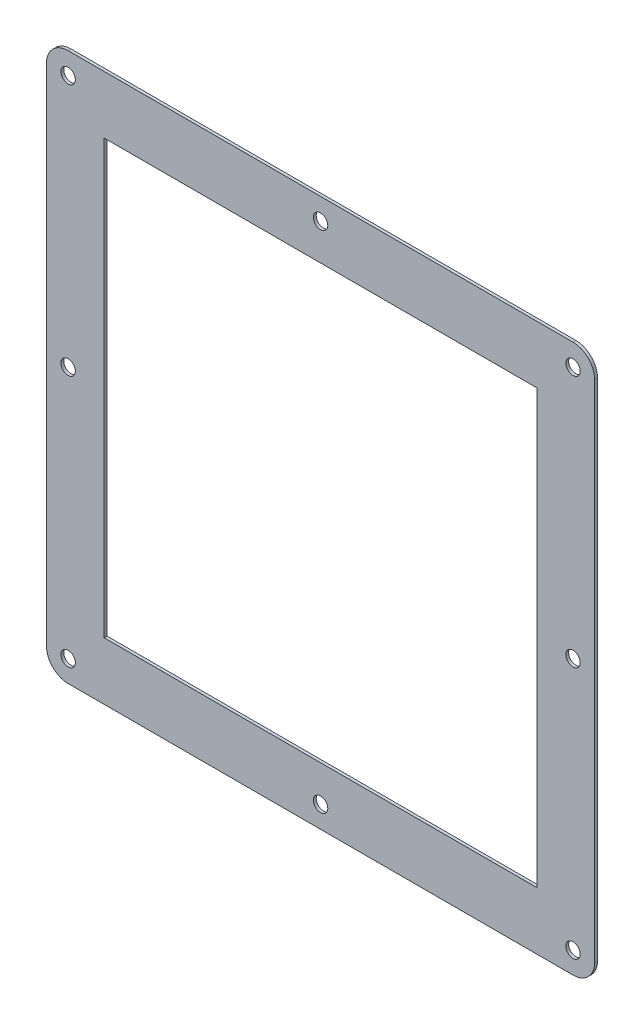
ISO-10303-21;
HEADER;
FILE_DESCRIPTION(('STEP AP214'),'2;1');
FILE_NAME('part.step','',(''),(''),'','','');
FILE_SCHEMA(('AUTOMOTIVE_DESIGN { 1 0 10303 214 1 1 1 1 }'));
ENDSEC;
DATA;
#1=APPLICATION_CONTEXT('core data for automotive mechanical design processes');
#2=APPLICATION_PROTOCOL_DEFINITION('international standard','automotive_design',2000,#1);
#3=PRODUCT_CONTEXT('',#1,'mechanical');
#4=PRODUCT('Part','Part','',(#3));
#5=PRODUCT_RELATED_PRODUCT_CATEGORY('part','',(#4));
#6=PRODUCT_DEFINITION_FORMATION('','',#4);
#7=PRODUCT_DEFINITION_CONTEXT('part definition',#1,'design');
#8=PRODUCT_DEFINITION('design','',#6,#7);
#9=PRODUCT_DEFINITION_SHAPE('','',#8);
#10=(LENGTH_UNIT() NAMED_UNIT(*) SI_UNIT(.MILLI.,.METRE.));
#11=(NAMED_UNIT(*) PLANE_ANGLE_UNIT() SI_UNIT($,.RADIAN.));
#12=(NAMED_UNIT(*) SI_UNIT($,.STERADIAN.) SOLID_ANGLE_UNIT());
#13=UNCERTAINTY_MEASURE_WITH_UNIT(LENGTH_MEASURE(1.E-05),#10,'distance_accuracy_value','');
#14=(GEOMETRIC_REPRESENTATION_CONTEXT(3) GLOBAL_UNCERTAINTY_ASSIGNED_CONTEXT((#13)) GLOBAL_UNIT_ASSIGNED_CONTEXT((#10,
#11,#12)) REPRESENTATION_CONTEXT('',''));
#15=CARTESIAN_POINT('',(0.,0.,0.));
#16=DIRECTION('',(0.,0.,1.));
#17=DIRECTION('',(1.,0.,0.));
#18=AXIS2_PLACEMENT_3D('',#15,#16,#17);
#19=CARTESIAN_POINT('',(-175.,-175.,2.));
#20=DIRECTION('',(0.,0.,1.));
#21=DIRECTION('',(1.,0.,0.));
#22=AXIS2_PLACEMENT_3D('',#19,#20,#21);
#23=PLANE('',#22);
#24=CARTESIAN_POINT('',(0.,-175.,2.));
#25=DIRECTION('',(0.,0.,1.));
#26=DIRECTION('',(1.,0.,0.));
#27=AXIS2_PLACEMENT_3D('',#24,#25,#26);
#28=CIRCLE('',#27,5.);
#29=CARTESIAN_POINT('',(5.,-175.,2.));
#30=VERTEX_POINT('',#29);
#31=EDGE_CURVE('E372',#30,#30,#28,.T.);
#32=ORIENTED_EDGE('',*,*,#31,.F.);
#33=EDGE_LOOP('',(#32));
#34=FACE_BOUND('',#33,.T.);
#35=DIRECTION('',(-1.,0.,0.));
#36=VECTOR('',#35,1.);
#37=CARTESIAN_POINT('',(-150.,150.,2.));
#38=LINE('',#37,#36);
#39=CARTESIAN_POINT('',(150.,150.,2.));
#40=VERTEX_POINT('',#39);
#41=CARTESIAN_POINT('',(-150.,150.,2.));
#42=VERTEX_POINT('',#41);
#43=EDGE_CURVE('E130',#40,#42,#38,.T.);
#44=ORIENTED_EDGE('',*,*,#43,.F.);
#45=DIRECTION('',(0.,1.,0.));
#46=VECTOR('',#45,1.);
#47=CARTESIAN_POINT('',(150.,150.,2.));
#48=LINE('',#47,#46);
#49=CARTESIAN_POINT('',(150.,-150.,2.));
#50=VERTEX_POINT('',#49);
#51=EDGE_CURVE('E122',#50,#40,#48,.T.);
#52=ORIENTED_EDGE('',*,*,#51,.F.);
#53=DIRECTION('',(1.,0.,0.));
#54=VECTOR('',#53,1.);
#55=CARTESIAN_POINT('',(-150.,-150.,2.));
#56=LINE('',#55,#54);
#57=CARTESIAN_POINT('',(-150.,-150.,2.));
#58=VERTEX_POINT('',#57);
#59=EDGE_CURVE('E145',#58,#50,#56,.T.);
#60=ORIENTED_EDGE('',*,*,#59,.F.);
#61=DIRECTION('',(0.,-1.,0.));
#62=VECTOR('',#61,1.);
#63=CARTESIAN_POINT('',(-150.,150.,2.));
#64=LINE('',#63,#62);
#65=EDGE_CURVE('E143',#42,#58,#64,.T.);
#66=ORIENTED_EDGE('',*,*,#65,.F.);
#67=EDGE_LOOP('',(#44,#52,#60,#66));
#68=FACE_BOUND('',#67,.T.);
#69=CARTESIAN_POINT('',(-175.,0.,2.));
#70=DIRECTION('',(0.,0.,1.));
#71=DIRECTION('',(1.,0.,0.));
#72=AXIS2_PLACEMENT_3D('',#69,#70,#71);
#73=CIRCLE('',#72,5.00000000000002);
#74=CARTESIAN_POINT('',(-170.,0.,2.));
#75=VERTEX_POINT('',#74);
#76=EDGE_CURVE('E161',#75,#75,#73,.T.);
#77=ORIENTED_EDGE('',*,*,#76,.F.);
#78=EDGE_LOOP('',(#77));
#79=FACE_BOUND('',#78,.T.);
#80=CARTESIAN_POINT('',(175.,175.,2.));
#81=DIRECTION('',(0.,0.,1.));
#82=DIRECTION('',(1.,0.,0.));
#83=AXIS2_PLACEMENT_3D('',#80,#81,#82);
#84=CIRCLE('',#83,4.99999999999999);
#85=CARTESIAN_POINT('',(180.,175.,2.));
#86=VERTEX_POINT('',#85);
#87=EDGE_CURVE('E173',#86,#86,#84,.T.);
#88=ORIENTED_EDGE('',*,*,#87,.F.);
#89=EDGE_LOOP('',(#88));
#90=FACE_BOUND('',#89,.T.);
#91=CARTESIAN_POINT('',(-175.,175.,2.));
#92=DIRECTION('',(0.,0.,1.));
#93=DIRECTION('',(1.,0.,0.));
#94=AXIS2_PLACEMENT_3D('',#91,#92,#93);
#95=CIRCLE('',#94,4.99999999999999);
#96=CARTESIAN_POINT('',(-170.,175.,2.));
#97=VERTEX_POINT('',#96);
#98=EDGE_CURVE('E185',#97,#97,#95,.T.);
#99=ORIENTED_EDGE('',*,*,#98,.F.);
#100=EDGE_LOOP('',(#99));
#101=FACE_BOUND('',#100,.T.);
#102=CARTESIAN_POINT('',(-175.,-175.,2.));
#103=DIRECTION('',(0.,0.,1.));
#104=DIRECTION('',(1.,0.,0.));
#105=AXIS2_PLACEMENT_3D('',#102,#103,#104);
#106=CIRCLE('',#105,15.);
#107=CARTESIAN_POINT('',(-190.,-175.,2.));
#108=VERTEX_POINT('',#107);
#109=CARTESIAN_POINT('',(-175.,-190.,2.));
#110=VERTEX_POINT('',#109);
#111=EDGE_CURVE('E191',#108,#110,#106,.T.);
#112=ORIENTED_EDGE('',*,*,#111,.T.);
#113=DIRECTION('',(1.,0.,0.));
#114=VECTOR('',#113,1.);
#115=CARTESIAN_POINT('',(-175.,-190.,2.));
#116=LINE('',#115,#114);
#117=CARTESIAN_POINT('',(175.,-190.,2.));
#118=VERTEX_POINT('',#117);
#119=EDGE_CURVE('E194',#110,#118,#116,.T.);
#120=ORIENTED_EDGE('',*,*,#119,.T.);
#121=CARTESIAN_POINT('',(175.,-175.,2.));
#122=DIRECTION('',(0.,0.,1.));
#123=DIRECTION('',(1.,0.,0.));
#124=AXIS2_PLACEMENT_3D('',#121,#122,#123);
#125=CIRCLE('',#124,15.);
#126=CARTESIAN_POINT('',(190.,-175.,2.));
#127=VERTEX_POINT('',#126);
#128=EDGE_CURVE('E197',#118,#127,#125,.T.);
#129=ORIENTED_EDGE('',*,*,#128,.T.);
#130=DIRECTION('',(0.,1.,0.));
#131=VECTOR('',#130,1.);
#132=CARTESIAN_POINT('',(190.,175.,2.));
#133=LINE('',#132,#131);
#134=CARTESIAN_POINT('',(190.,175.,2.));
#135=VERTEX_POINT('',#134);
#136=EDGE_CURVE('E199',#127,#135,#133,.T.);
#137=ORIENTED_EDGE('',*,*,#136,.T.);
#138=CARTESIAN_POINT('',(175.,175.,2.));
#139=DIRECTION('',(0.,0.,1.));
#140=DIRECTION('',(-1.,0.,0.));
#141=AXIS2_PLACEMENT_3D('',#138,#139,#140);
#142=CIRCLE('',#141,15.);
#143=CARTESIAN_POINT('',(175.,190.,2.));
#144=VERTEX_POINT('',#143);
#145=EDGE_CURVE('E201',#135,#144,#142,.T.);
#146=ORIENTED_EDGE('',*,*,#145,.T.);
#147=DIRECTION('',(-1.,0.,0.));
#148=VECTOR('',#147,1.);
#149=CARTESIAN_POINT('',(-175.,190.,2.));
#150=LINE('',#149,#148);
#151=CARTESIAN_POINT('',(-175.,190.,2.));
#152=VERTEX_POINT('',#151);
#153=EDGE_CURVE('E203',#144,#152,#150,.T.);
#154=ORIENTED_EDGE('',*,*,#153,.T.);
#155=CARTESIAN_POINT('',(-175.,175.,2.));
#156=DIRECTION('',(0.,0.,1.));
#157=DIRECTION('',(1.,0.,0.));
#158=AXIS2_PLACEMENT_3D('',#155,#156,#157);
#159=CIRCLE('',#158,15.0000000000001);
#160=CARTESIAN_POINT('',(-190.,175.,2.));
#161=VERTEX_POINT('',#160);
#162=EDGE_CURVE('E205',#152,#161,#159,.T.);
#163=ORIENTED_EDGE('',*,*,#162,.T.);
#164=DIRECTION('',(0.,-1.,0.));
#165=VECTOR('',#164,1.);
#166=CARTESIAN_POINT('',(-190.,175.,2.));
#167=LINE('',#166,#165);
#168=EDGE_CURVE('E207',#161,#108,#167,.T.);
#169=ORIENTED_EDGE('',*,*,#168,.T.);
#170=EDGE_LOOP('',(#112,#120,#129,#137,#146,#154,#163,#169));
#171=FACE_BOUND('',#170,.T.);
#172=CARTESIAN_POINT('',(0.,175.,2.));
#173=DIRECTION('',(0.,0.,1.));
#174=DIRECTION('',(1.,0.,0.));
#175=AXIS2_PLACEMENT_3D('',#172,#173,#174);
#176=CIRCLE('',#175,5.00000000000001);
#177=CARTESIAN_POINT('',(5.00000000000001,175.,2.));
#178=VERTEX_POINT('',#177);
#179=EDGE_CURVE('E179',#178,#178,#176,.T.);
#180=ORIENTED_EDGE('',*,*,#179,.F.);
#181=EDGE_LOOP('',(#180));
#182=FACE_BOUND('',#181,.T.);
#183=CARTESIAN_POINT('',(175.,0.,2.));
#184=DIRECTION('',(0.,0.,1.));
#185=DIRECTION('',(1.,0.,0.));
#186=AXIS2_PLACEMENT_3D('',#183,#184,#185);
#187=CIRCLE('',#186,5.00000000000002);
#188=CARTESIAN_POINT('',(180.,0.,2.));
#189=VERTEX_POINT('',#188);
#190=EDGE_CURVE('E167',#189,#189,#187,.T.);
#191=ORIENTED_EDGE('',*,*,#190,.F.);
#192=EDGE_LOOP('',(#191));
#193=FACE_BOUND('',#192,.T.);
#194=CARTESIAN_POINT('',(-175.,-175.,2.));
#195=DIRECTION('',(0.,0.,1.));
#196=DIRECTION('',(1.,0.,0.));
#197=AXIS2_PLACEMENT_3D('',#194,#195,#196);
#198=CIRCLE('',#197,4.99999999999999);
#199=CARTESIAN_POINT('',(-170.,-175.,2.));
#200=VERTEX_POINT('',#199);
#201=EDGE_CURVE('E151',#200,#200,#198,.T.);
#202=ORIENTED_EDGE('',*,*,#201,.F.);
#203=EDGE_LOOP('',(#202));
#204=FACE_BOUND('',#203,.T.);
#205=CARTESIAN_POINT('',(175.,-175.,2.));
#206=DIRECTION('',(0.,0.,1.));
#207=DIRECTION('',(1.,0.,0.));
#208=AXIS2_PLACEMENT_3D('',#205,#206,#207);
#209=CIRCLE('',#208,4.99999999999999);
#210=CARTESIAN_POINT('',(180.,-175.,2.));
#211=VERTEX_POINT('',#210);
#212=EDGE_CURVE('E363',#211,#211,#209,.T.);
#213=ORIENTED_EDGE('',*,*,#212,.F.);
#214=EDGE_LOOP('',(#213));
#215=FACE_BOUND('',#214,.T.);
#216=ADVANCED_FACE('F33',(#34,#68,#79,#90,#101,#171,#182,#193,#204,#215),#23,.T.);
#217=CARTESIAN_POINT('',(-175.,-175.,0.));
#218=DIRECTION('',(0.,0.,1.));
#219=DIRECTION('',(1.,0.,0.));
#220=AXIS2_PLACEMENT_3D('',#217,#218,#219);
#221=PLANE('',#220);
#222=CARTESIAN_POINT('',(-175.,0.,0.));
#223=DIRECTION('',(0.,0.,1.));
#224=DIRECTION('',(1.,0.,0.));
#225=AXIS2_PLACEMENT_3D('',#222,#223,#224);
#226=CIRCLE('',#225,5.00000000000002);
#227=CARTESIAN_POINT('',(-170.,0.,0.));
#228=VERTEX_POINT('',#227);
#229=EDGE_CURVE('E138',#228,#228,#226,.T.);
#230=ORIENTED_EDGE('',*,*,#229,.T.);
#231=EDGE_LOOP('',(#230));
#232=FACE_BOUND('',#231,.T.);
#233=CARTESIAN_POINT('',(175.,0.,0.));
#234=DIRECTION('',(0.,0.,1.));
#235=DIRECTION('',(1.,0.,0.));
#236=AXIS2_PLACEMENT_3D('',#233,#234,#235);
#237=CIRCLE('',#236,5.00000000000002);
#238=CARTESIAN_POINT('',(180.,0.,0.));
#239=VERTEX_POINT('',#238);
#240=EDGE_CURVE('E164',#239,#239,#237,.T.);
#241=ORIENTED_EDGE('',*,*,#240,.T.);
#242=EDGE_LOOP('',(#241));
#243=FACE_BOUND('',#242,.T.);
#244=CARTESIAN_POINT('',(175.,175.,0.));
#245=DIRECTION('',(0.,0.,1.));
#246=DIRECTION('',(1.,0.,0.));
#247=AXIS2_PLACEMENT_3D('',#244,#245,#246);
#248=CIRCLE('',#247,4.99999999999999);
#249=CARTESIAN_POINT('',(180.,175.,0.));
#250=VERTEX_POINT('',#249);
#251=EDGE_CURVE('E170',#250,#250,#248,.T.);
#252=ORIENTED_EDGE('',*,*,#251,.T.);
#253=EDGE_LOOP('',(#252));
#254=FACE_BOUND('',#253,.T.);
#255=CARTESIAN_POINT('',(0.,175.,0.));
#256=DIRECTION('',(0.,0.,1.));
#257=DIRECTION('',(1.,0.,0.));
#258=AXIS2_PLACEMENT_3D('',#255,#256,#257);
#259=CIRCLE('',#258,5.00000000000001);
#260=CARTESIAN_POINT('',(5.00000000000001,175.,0.));
#261=VERTEX_POINT('',#260);
#262=EDGE_CURVE('E176',#261,#261,#259,.T.);
#263=ORIENTED_EDGE('',*,*,#262,.T.);
#264=EDGE_LOOP('',(#263));
#265=FACE_BOUND('',#264,.T.);
#266=CARTESIAN_POINT('',(-175.,175.,0.));
#267=DIRECTION('',(0.,0.,1.));
#268=DIRECTION('',(1.,0.,0.));
#269=AXIS2_PLACEMENT_3D('',#266,#267,#268);
#270=CIRCLE('',#269,4.99999999999999);
#271=CARTESIAN_POINT('',(-170.,175.,0.));
#272=VERTEX_POINT('',#271);
#273=EDGE_CURVE('E182',#272,#272,#270,.T.);
#274=ORIENTED_EDGE('',*,*,#273,.T.);
#275=EDGE_LOOP('',(#274));
#276=FACE_BOUND('',#275,.T.);
#277=CARTESIAN_POINT('',(-175.,-175.,0.));
#278=DIRECTION('',(0.,0.,1.));
#279=DIRECTION('',(1.,0.,0.));
#280=AXIS2_PLACEMENT_3D('',#277,#278,#279);
#281=CIRCLE('',#280,15.);
#282=CARTESIAN_POINT('',(-190.,-175.,0.));
#283=VERTEX_POINT('',#282);
#284=CARTESIAN_POINT('',(-175.,-190.,0.));
#285=VERTEX_POINT('',#284);
#286=EDGE_CURVE('E188',#283,#285,#281,.T.);
#287=ORIENTED_EDGE('',*,*,#286,.F.);
#288=DIRECTION('',(0.,-1.,0.));
#289=VECTOR('',#288,1.);
#290=CARTESIAN_POINT('',(-190.,175.,0.));
#291=LINE('',#290,#289);
#292=CARTESIAN_POINT('',(-190.,175.,0.));
#293=VERTEX_POINT('',#292);
#294=EDGE_CURVE('E195',#293,#283,#291,.T.);
#295=ORIENTED_EDGE('',*,*,#294,.F.);
#296=CARTESIAN_POINT('',(-175.,175.,0.));
#297=DIRECTION('',(0.,0.,1.));
#298=DIRECTION('',(1.,0.,0.));
#299=AXIS2_PLACEMENT_3D('',#296,#297,#298);
#300=CIRCLE('',#299,15.0000000000001);
#301=CARTESIAN_POINT('',(-175.,190.,0.));
#302=VERTEX_POINT('',#301);
#303=EDGE_CURVE('E222',#302,#293,#300,.T.);
#304=ORIENTED_EDGE('',*,*,#303,.F.);
#305=DIRECTION('',(-1.,0.,0.));
#306=VECTOR('',#305,1.);
#307=CARTESIAN_POINT('',(-175.,190.,0.));
#308=LINE('',#307,#306);
#309=CARTESIAN_POINT('',(175.,190.,0.));
#310=VERTEX_POINT('',#309);
#311=EDGE_CURVE('E220',#310,#302,#308,.T.);
#312=ORIENTED_EDGE('',*,*,#311,.F.);
#313=CARTESIAN_POINT('',(175.,175.,0.));
#314=DIRECTION('',(0.,0.,1.));
#315=DIRECTION('',(-1.,0.,0.));
#316=AXIS2_PLACEMENT_3D('',#313,#314,#315);
#317=CIRCLE('',#316,15.);
#318=CARTESIAN_POINT('',(190.,175.,0.));
#319=VERTEX_POINT('',#318);
#320=EDGE_CURVE('E218',#319,#310,#317,.T.);
#321=ORIENTED_EDGE('',*,*,#320,.F.);
#322=DIRECTION('',(0.,1.,0.));
#323=VECTOR('',#322,1.);
#324=CARTESIAN_POINT('',(190.,175.,0.));
#325=LINE('',#324,#323);
#326=CARTESIAN_POINT('',(190.,-175.,0.));
#327=VERTEX_POINT('',#326);
#328=EDGE_CURVE('E216',#327,#319,#325,.T.);
#329=ORIENTED_EDGE('',*,*,#328,.F.);
#330=CARTESIAN_POINT('',(175.,-175.,0.));
#331=DIRECTION('',(0.,0.,1.));
#332=DIRECTION('',(1.,0.,0.));
#333=AXIS2_PLACEMENT_3D('',#330,#331,#332);
#334=CIRCLE('',#333,15.);
#335=CARTESIAN_POINT('',(175.,-190.,0.));
#336=VERTEX_POINT('',#335);
#337=EDGE_CURVE('E214',#336,#327,#334,.T.);
#338=ORIENTED_EDGE('',*,*,#337,.F.);
#339=DIRECTION('',(1.,0.,0.));
#340=VECTOR('',#339,1.);
#341=CARTESIAN_POINT('',(-175.,-190.,0.));
#342=LINE('',#341,#340);
#343=EDGE_CURVE('E212',#285,#336,#342,.T.);
#344=ORIENTED_EDGE('',*,*,#343,.F.);
#345=EDGE_LOOP('',(#287,#295,#304,#312,#321,#329,#338,#344));
#346=FACE_BOUND('',#345,.T.);
#347=DIRECTION('',(0.,1.,0.));
#348=VECTOR('',#347,1.);
#349=CARTESIAN_POINT('',(150.,150.,0.));
#350=LINE('',#349,#348);
#351=CARTESIAN_POINT('',(150.,-150.,0.));
#352=VERTEX_POINT('',#351);
#353=CARTESIAN_POINT('',(150.,150.,0.));
#354=VERTEX_POINT('',#353);
#355=EDGE_CURVE('E56',#352,#354,#350,.T.);
#356=ORIENTED_EDGE('',*,*,#355,.T.);
#357=DIRECTION('',(-1.,0.,0.));
#358=VECTOR('',#357,1.);
#359=CARTESIAN_POINT('',(-150.,150.,0.));
#360=LINE('',#359,#358);
#361=CARTESIAN_POINT('',(-150.,150.,0.));
#362=VERTEX_POINT('',#361);
#363=EDGE_CURVE('E137',#354,#362,#360,.T.);
#364=ORIENTED_EDGE('',*,*,#363,.T.);
#365=DIRECTION('',(0.,-1.,0.));
#366=VECTOR('',#365,1.);
#367=CARTESIAN_POINT('',(-150.,150.,0.));
#368=LINE('',#367,#366);
#369=CARTESIAN_POINT('',(-150.,-150.,0.));
#370=VERTEX_POINT('',#369);
#371=EDGE_CURVE('E153',#362,#370,#368,.T.);
#372=ORIENTED_EDGE('',*,*,#371,.T.);
#373=DIRECTION('',(1.,0.,0.));
#374=VECTOR('',#373,1.);
#375=CARTESIAN_POINT('',(-150.,-150.,0.));
#376=LINE('',#375,#374);
#377=EDGE_CURVE('E131',#370,#352,#376,.T.);
#378=ORIENTED_EDGE('',*,*,#377,.T.);
#379=EDGE_LOOP('',(#356,#364,#372,#378));
#380=FACE_BOUND('',#379,.T.);
#381=CARTESIAN_POINT('',(-175.,-175.,0.));
#382=DIRECTION('',(0.,0.,1.));
#383=DIRECTION('',(1.,0.,0.));
#384=AXIS2_PLACEMENT_3D('',#381,#382,#383);
#385=CIRCLE('',#384,4.99999999999999);
#386=CARTESIAN_POINT('',(-170.,-175.,0.));
#387=VERTEX_POINT('',#386);
#388=EDGE_CURVE('E375',#387,#387,#385,.T.);
#389=ORIENTED_EDGE('',*,*,#388,.T.);
#390=EDGE_LOOP('',(#389));
#391=FACE_BOUND('',#390,.T.);
#392=CARTESIAN_POINT('',(0.,-175.,0.));
#393=DIRECTION('',(0.,0.,1.));
#394=DIRECTION('',(1.,0.,0.));
#395=AXIS2_PLACEMENT_3D('',#392,#393,#394);
#396=CIRCLE('',#395,5.);
#397=CARTESIAN_POINT('',(5.,-175.,0.));
#398=VERTEX_POINT('',#397);
#399=EDGE_CURVE('E369',#398,#398,#396,.T.);
#400=ORIENTED_EDGE('',*,*,#399,.T.);
#401=EDGE_LOOP('',(#400));
#402=FACE_BOUND('',#401,.T.);
#403=CARTESIAN_POINT('',(175.,-175.,0.));
#404=DIRECTION('',(0.,0.,1.));
#405=DIRECTION('',(1.,0.,0.));
#406=AXIS2_PLACEMENT_3D('',#403,#404,#405);
#407=CIRCLE('',#406,4.99999999999999);
#408=CARTESIAN_POINT('',(180.,-175.,0.));
#409=VERTEX_POINT('',#408);
#410=EDGE_CURVE('E366',#409,#409,#407,.T.);
#411=ORIENTED_EDGE('',*,*,#410,.T.);
#412=EDGE_LOOP('',(#411));
#413=FACE_BOUND('',#412,.T.);
#414=ADVANCED_FACE('F252',(#232,#243,#254,#265,#276,#346,#380,#391,#402,#413),#221,.F.);
#415=CARTESIAN_POINT('',(-175.,-175.,2.));
#416=DIRECTION('',(0.,0.,-1.));
#417=DIRECTION('',(-1.,0.,0.));
#418=AXIS2_PLACEMENT_3D('',#415,#416,#417);
#419=CYLINDRICAL_SURFACE('',#418,15.);
#420=ORIENTED_EDGE('',*,*,#286,.T.);
#421=DIRECTION('',(0.,0.,-1.));
#422=VECTOR('',#421,1.);
#423=CARTESIAN_POINT('',(-175.,-190.,2.));
#424=LINE('',#423,#422);
#425=EDGE_CURVE('E11',#110,#285,#424,.T.);
#426=ORIENTED_EDGE('',*,*,#425,.F.);
#427=ORIENTED_EDGE('',*,*,#111,.F.);
#428=DIRECTION('',(0.,0.,-1.));
#429=VECTOR('',#428,1.);
#430=CARTESIAN_POINT('',(-190.,-175.,2.));
#431=LINE('',#430,#429);
#432=EDGE_CURVE('E209',#108,#283,#431,.T.);
#433=ORIENTED_EDGE('',*,*,#432,.T.);
#434=EDGE_LOOP('',(#420,#426,#427,#433));
#435=FACE_BOUND('',#434,.T.);
#436=ADVANCED_FACE('F35',(#435),#419,.T.);
#437=CARTESIAN_POINT('',(-175.,-190.,2.));
#438=DIRECTION('',(0.,1.,0.));
#439=DIRECTION('',(0.,0.,1.));
#440=AXIS2_PLACEMENT_3D('',#437,#438,#439);
#441=PLANE('',#440);
#442=ORIENTED_EDGE('',*,*,#343,.T.);
#443=DIRECTION('',(0.,0.,-1.));
#444=VECTOR('',#443,1.);
#445=CARTESIAN_POINT('',(175.,-190.,2.));
#446=LINE('',#445,#444);
#447=EDGE_CURVE('E41',#118,#336,#446,.T.);
#448=ORIENTED_EDGE('',*,*,#447,.F.);
#449=ORIENTED_EDGE('',*,*,#119,.F.);
#450=ORIENTED_EDGE('',*,*,#425,.T.);
#451=EDGE_LOOP('',(#442,#448,#449,#450));
#452=FACE_BOUND('',#451,.T.);
#453=ADVANCED_FACE('F270',(#452),#441,.F.);
#454=CARTESIAN_POINT('',(175.,-175.,2.));
#455=DIRECTION('',(0.,0.,-1.));
#456=DIRECTION('',(-1.,0.,0.));
#457=AXIS2_PLACEMENT_3D('',#454,#455,#456);
#458=CYLINDRICAL_SURFACE('',#457,15.);
#459=ORIENTED_EDGE('',*,*,#337,.T.);
#460=DIRECTION('',(0.,0.,-1.));
#461=VECTOR('',#460,1.);
#462=CARTESIAN_POINT('',(190.,-175.,2.));
#463=LINE('',#462,#461);
#464=EDGE_CURVE('E239',#127,#327,#463,.T.);
#465=ORIENTED_EDGE('',*,*,#464,.F.);
#466=ORIENTED_EDGE('',*,*,#128,.F.);
#467=ORIENTED_EDGE('',*,*,#447,.T.);
#468=EDGE_LOOP('',(#459,#465,#466,#467));
#469=FACE_BOUND('',#468,.T.);
#470=ADVANCED_FACE('F246',(#469),#458,.T.);
#471=CARTESIAN_POINT('',(190.,175.,2.));
#472=DIRECTION('',(-1.,0.,0.));
#473=DIRECTION('',(0.,-1.,0.));
#474=AXIS2_PLACEMENT_3D('',#471,#472,#473);
#475=PLANE('',#474);
#476=ORIENTED_EDGE('',*,*,#328,.T.);
#477=DIRECTION('',(0.,0.,-1.));
#478=VECTOR('',#477,1.);
#479=CARTESIAN_POINT('',(190.,175.,2.));
#480=LINE('',#479,#478);
#481=EDGE_CURVE('E236',#135,#319,#480,.T.);
#482=ORIENTED_EDGE('',*,*,#481,.F.);
#483=ORIENTED_EDGE('',*,*,#136,.F.);
#484=ORIENTED_EDGE('',*,*,#464,.T.);
#485=EDGE_LOOP('',(#476,#482,#483,#484));
#486=FACE_BOUND('',#485,.T.);
#487=ADVANCED_FACE('F258',(#486),#475,.F.);
#488=CARTESIAN_POINT('',(175.,175.,2.));
#489=DIRECTION('',(0.,0.,-1.));
#490=DIRECTION('',(-1.,0.,0.));
#491=AXIS2_PLACEMENT_3D('',#488,#489,#490);
#492=CYLINDRICAL_SURFACE('',#491,15.);
#493=ORIENTED_EDGE('',*,*,#320,.T.);
#494=DIRECTION('',(0.,0.,-1.));
#495=VECTOR('',#494,1.);
#496=CARTESIAN_POINT('',(175.,190.,2.));
#497=LINE('',#496,#495);
#498=EDGE_CURVE('E233',#144,#310,#497,.T.);
#499=ORIENTED_EDGE('',*,*,#498,.F.);
#500=ORIENTED_EDGE('',*,*,#145,.F.);
#501=ORIENTED_EDGE('',*,*,#481,.T.);
#502=EDGE_LOOP('',(#493,#499,#500,#501));
#503=FACE_BOUND('',#502,.T.);
#504=ADVANCED_FACE('F262',(#503),#492,.T.);
#505=CARTESIAN_POINT('',(-175.,190.,2.));
#506=DIRECTION('',(0.,-1.,0.));
#507=DIRECTION('',(0.,0.,-1.));
#508=AXIS2_PLACEMENT_3D('',#505,#506,#507);
#509=PLANE('',#508);
#510=ORIENTED_EDGE('',*,*,#311,.T.);
#511=DIRECTION('',(0.,0.,-1.));
#512=VECTOR('',#511,1.);
#513=CARTESIAN_POINT('',(-175.,190.,2.));
#514=LINE('',#513,#512);
#515=EDGE_CURVE('E230',#152,#302,#514,.T.);
#516=ORIENTED_EDGE('',*,*,#515,.F.);
#517=ORIENTED_EDGE('',*,*,#153,.F.);
#518=ORIENTED_EDGE('',*,*,#498,.T.);
#519=EDGE_LOOP('',(#510,#516,#517,#518));
#520=FACE_BOUND('',#519,.T.);
#521=ADVANCED_FACE('F283',(#520),#509,.F.);
#522=CARTESIAN_POINT('',(-175.,175.,2.));
#523=DIRECTION('',(0.,0.,-1.));
#524=DIRECTION('',(-1.,0.,0.));
#525=AXIS2_PLACEMENT_3D('',#522,#523,#524);
#526=CYLINDRICAL_SURFACE('',#525,15.0000000000001);
#527=ORIENTED_EDGE('',*,*,#303,.T.);
#528=DIRECTION('',(0.,0.,-1.));
#529=VECTOR('',#528,1.);
#530=CARTESIAN_POINT('',(-190.,175.,2.));
#531=LINE('',#530,#529);
#532=EDGE_CURVE('E227',#161,#293,#531,.T.);
#533=ORIENTED_EDGE('',*,*,#532,.F.);
#534=ORIENTED_EDGE('',*,*,#162,.F.);
#535=ORIENTED_EDGE('',*,*,#515,.T.);
#536=EDGE_LOOP('',(#527,#533,#534,#535));
#537=FACE_BOUND('',#536,.T.);
#538=ADVANCED_FACE('F281',(#537),#526,.T.);
#539=CARTESIAN_POINT('',(-190.,175.,2.));
#540=DIRECTION('',(1.,0.,0.));
#541=DIRECTION('',(0.,1.,0.));
#542=AXIS2_PLACEMENT_3D('',#539,#540,#541);
#543=PLANE('',#542);
#544=ORIENTED_EDGE('',*,*,#294,.T.);
#545=ORIENTED_EDGE('',*,*,#432,.F.);
#546=ORIENTED_EDGE('',*,*,#168,.F.);
#547=ORIENTED_EDGE('',*,*,#532,.T.);
#548=EDGE_LOOP('',(#544,#545,#546,#547));
#549=FACE_BOUND('',#548,.T.);
#550=ADVANCED_FACE('F276',(#549),#543,.F.);
#551=CARTESIAN_POINT('',(-175.,175.,2.));
#552=DIRECTION('',(0.,0.,-1.));
#553=DIRECTION('',(-1.,0.,0.));
#554=AXIS2_PLACEMENT_3D('',#551,#552,#553);
#555=CYLINDRICAL_SURFACE('',#554,4.99999999999999);
#556=ORIENTED_EDGE('',*,*,#98,.T.);
#557=EDGE_LOOP('',(#556));
#558=FACE_BOUND('',#557,.T.);
#559=ORIENTED_EDGE('',*,*,#273,.F.);
#560=EDGE_LOOP('',(#559));
#561=FACE_BOUND('',#560,.T.);
#562=ADVANCED_FACE('F302',(#558,#561),#555,.F.);
#563=CARTESIAN_POINT('',(0.,175.,2.));
#564=DIRECTION('',(0.,0.,-1.));
#565=DIRECTION('',(-1.,0.,0.));
#566=AXIS2_PLACEMENT_3D('',#563,#564,#565);
#567=CYLINDRICAL_SURFACE('',#566,5.00000000000001);
#568=ORIENTED_EDGE('',*,*,#179,.T.);
#569=EDGE_LOOP('',(#568));
#570=FACE_BOUND('',#569,.T.);
#571=ORIENTED_EDGE('',*,*,#262,.F.);
#572=EDGE_LOOP('',(#571));
#573=FACE_BOUND('',#572,.T.);
#574=ADVANCED_FACE('F309',(#570,#573),#567,.F.);
#575=CARTESIAN_POINT('',(175.,175.,2.));
#576=DIRECTION('',(0.,0.,-1.));
#577=DIRECTION('',(-1.,0.,0.));
#578=AXIS2_PLACEMENT_3D('',#575,#576,#577);
#579=CYLINDRICAL_SURFACE('',#578,4.99999999999999);
#580=ORIENTED_EDGE('',*,*,#87,.T.);
#581=EDGE_LOOP('',(#580));
#582=FACE_BOUND('',#581,.T.);
#583=ORIENTED_EDGE('',*,*,#251,.F.);
#584=EDGE_LOOP('',(#583));
#585=FACE_BOUND('',#584,.T.);
#586=ADVANCED_FACE('F314',(#582,#585),#579,.F.);
#587=CARTESIAN_POINT('',(175.,0.,2.));
#588=DIRECTION('',(0.,0.,-1.));
#589=DIRECTION('',(-1.,0.,0.));
#590=AXIS2_PLACEMENT_3D('',#587,#588,#589);
#591=CYLINDRICAL_SURFACE('',#590,5.00000000000002);
#592=ORIENTED_EDGE('',*,*,#190,.T.);
#593=EDGE_LOOP('',(#592));
#594=FACE_BOUND('',#593,.T.);
#595=ORIENTED_EDGE('',*,*,#240,.F.);
#596=EDGE_LOOP('',(#595));
#597=FACE_BOUND('',#596,.T.);
#598=ADVANCED_FACE('F324',(#594,#597),#591,.F.);
#599=CARTESIAN_POINT('',(-175.,0.,2.));
#600=DIRECTION('',(0.,0.,-1.));
#601=DIRECTION('',(-1.,0.,0.));
#602=AXIS2_PLACEMENT_3D('',#599,#600,#601);
#603=CYLINDRICAL_SURFACE('',#602,5.00000000000002);
#604=ORIENTED_EDGE('',*,*,#76,.T.);
#605=EDGE_LOOP('',(#604));
#606=FACE_BOUND('',#605,.T.);
#607=ORIENTED_EDGE('',*,*,#229,.F.);
#608=EDGE_LOOP('',(#607));
#609=FACE_BOUND('',#608,.T.);
#610=ADVANCED_FACE('F331',(#606,#609),#603,.F.);
#611=CARTESIAN_POINT('',(150.,150.,2.));
#612=DIRECTION('',(-1.,0.,0.));
#613=DIRECTION('',(0.,-1.,0.));
#614=AXIS2_PLACEMENT_3D('',#611,#612,#613);
#615=PLANE('',#614);
#616=ORIENTED_EDGE('',*,*,#355,.F.);
#617=DIRECTION('',(0.,0.,-1.));
#618=VECTOR('',#617,1.);
#619=CARTESIAN_POINT('',(150.,-150.,2.));
#620=LINE('',#619,#618);
#621=EDGE_CURVE('E126',#50,#352,#620,.T.);
#622=ORIENTED_EDGE('',*,*,#621,.F.);
#623=ORIENTED_EDGE('',*,*,#51,.T.);
#624=DIRECTION('',(0.,0.,-1.));
#625=VECTOR('',#624,1.);
#626=CARTESIAN_POINT('',(150.,150.,2.));
#627=LINE('',#626,#625);
#628=EDGE_CURVE('E125',#40,#354,#627,.T.);
#629=ORIENTED_EDGE('',*,*,#628,.T.);
#630=EDGE_LOOP('',(#616,#622,#623,#629));
#631=FACE_BOUND('',#630,.T.);
#632=ADVANCED_FACE('F124',(#631),#615,.T.);
#633=CARTESIAN_POINT('',(-150.,150.,2.));
#634=DIRECTION('',(0.,-1.,0.));
#635=DIRECTION('',(0.,0.,-1.));
#636=AXIS2_PLACEMENT_3D('',#633,#634,#635);
#637=PLANE('',#636);
#638=ORIENTED_EDGE('',*,*,#363,.F.);
#639=ORIENTED_EDGE('',*,*,#628,.F.);
#640=ORIENTED_EDGE('',*,*,#43,.T.);
#641=DIRECTION('',(0.,0.,-1.));
#642=VECTOR('',#641,1.);
#643=CARTESIAN_POINT('',(-150.,150.,2.));
#644=LINE('',#643,#642);
#645=EDGE_CURVE('E139',#42,#362,#644,.T.);
#646=ORIENTED_EDGE('',*,*,#645,.T.);
#647=EDGE_LOOP('',(#638,#639,#640,#646));
#648=FACE_BOUND('',#647,.T.);
#649=ADVANCED_FACE('F134',(#648),#637,.T.);
#650=CARTESIAN_POINT('',(-150.,150.,2.));
#651=DIRECTION('',(1.,0.,0.));
#652=DIRECTION('',(0.,0.,-1.));
#653=AXIS2_PLACEMENT_3D('',#650,#651,#652);
#654=PLANE('',#653);
#655=ORIENTED_EDGE('',*,*,#371,.F.);
#656=ORIENTED_EDGE('',*,*,#645,.F.);
#657=ORIENTED_EDGE('',*,*,#65,.T.);
#658=DIRECTION('',(0.,0.,-1.));
#659=VECTOR('',#658,1.);
#660=CARTESIAN_POINT('',(-150.,-150.,2.));
#661=LINE('',#660,#659);
#662=EDGE_CURVE('E48',#58,#370,#661,.T.);
#663=ORIENTED_EDGE('',*,*,#662,.T.);
#664=EDGE_LOOP('',(#655,#656,#657,#663));
#665=FACE_BOUND('',#664,.T.);
#666=ADVANCED_FACE('F340',(#665),#654,.T.);
#667=CARTESIAN_POINT('',(-150.,-150.,2.));
#668=DIRECTION('',(0.,1.,0.));
#669=DIRECTION('',(0.,0.,1.));
#670=AXIS2_PLACEMENT_3D('',#667,#668,#669);
#671=PLANE('',#670);
#672=ORIENTED_EDGE('',*,*,#377,.F.);
#673=ORIENTED_EDGE('',*,*,#662,.F.);
#674=ORIENTED_EDGE('',*,*,#59,.T.);
#675=ORIENTED_EDGE('',*,*,#621,.T.);
#676=EDGE_LOOP('',(#672,#673,#674,#675));
#677=FACE_BOUND('',#676,.T.);
#678=ADVANCED_FACE('F343',(#677),#671,.T.);
#679=CARTESIAN_POINT('',(-175.,-175.,2.));
#680=DIRECTION('',(0.,0.,-1.));
#681=DIRECTION('',(-1.,0.,0.));
#682=AXIS2_PLACEMENT_3D('',#679,#680,#681);
#683=CYLINDRICAL_SURFACE('',#682,4.99999999999999);
#684=ORIENTED_EDGE('',*,*,#201,.T.);
#685=EDGE_LOOP('',(#684));
#686=FACE_BOUND('',#685,.T.);
#687=ORIENTED_EDGE('',*,*,#388,.F.);
#688=EDGE_LOOP('',(#687));
#689=FACE_BOUND('',#688,.T.);
#690=ADVANCED_FACE('F347',(#686,#689),#683,.F.);
#691=CARTESIAN_POINT('',(0.,-175.,2.));
#692=DIRECTION('',(0.,0.,-1.));
#693=DIRECTION('',(-1.,0.,0.));
#694=AXIS2_PLACEMENT_3D('',#691,#692,#693);
#695=CYLINDRICAL_SURFACE('',#694,5.);
#696=ORIENTED_EDGE('',*,*,#31,.T.);
#697=EDGE_LOOP('',(#696));
#698=FACE_BOUND('',#697,.T.);
#699=ORIENTED_EDGE('',*,*,#399,.F.);
#700=EDGE_LOOP('',(#699));
#701=FACE_BOUND('',#700,.T.);
#702=ADVANCED_FACE('F350',(#698,#701),#695,.F.);
#703=CARTESIAN_POINT('',(175.,-175.,2.));
#704=DIRECTION('',(0.,0.,-1.));
#705=DIRECTION('',(-1.,0.,0.));
#706=AXIS2_PLACEMENT_3D('',#703,#704,#705);
#707=CYLINDRICAL_SURFACE('',#706,4.99999999999999);
#708=ORIENTED_EDGE('',*,*,#212,.T.);
#709=EDGE_LOOP('',(#708));
#710=FACE_BOUND('',#709,.T.);
#711=ORIENTED_EDGE('',*,*,#410,.F.);
#712=EDGE_LOOP('',(#711));
#713=FACE_BOUND('',#712,.T.);
#714=ADVANCED_FACE('F354',(#710,#713),#707,.F.);
#715=CLOSED_SHELL('',(#216,#414,#436,#453,#470,#487,#504,#521,#538,#550,#562,#574,#586,#598,
#610,#632,#649,#666,#678,#690,#702,#714));
#716=MANIFOLD_SOLID_BREP('B2',#715);
#717=ADVANCED_BREP_SHAPE_REPRESENTATION('',(#18,#716),#14);
#718=SHAPE_DEFINITION_REPRESENTATION(#9,#717);
ENDSEC;
END-ISO-10303-21;
